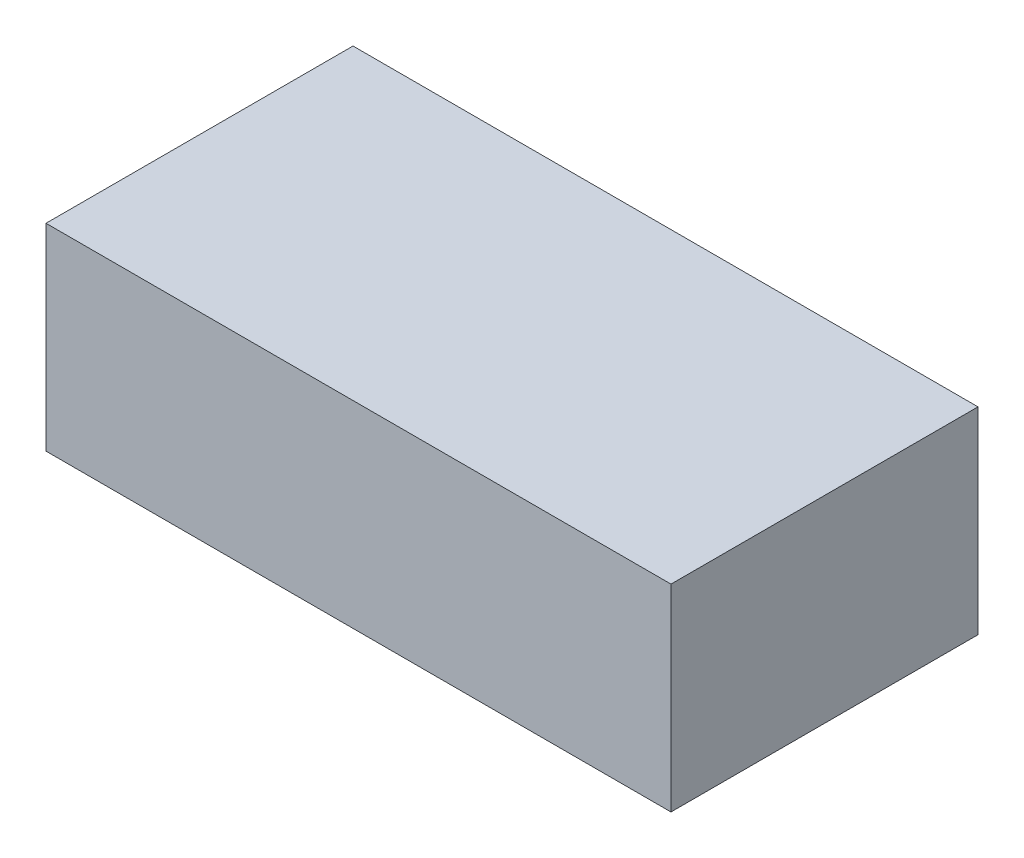
ISO-10303-21;
HEADER;
FILE_DESCRIPTION(('STEP AP214'),'2;1');
FILE_NAME('part.step','',(''),(''),'','','');
FILE_SCHEMA(('AUTOMOTIVE_DESIGN { 1 0 10303 214 1 1 1 1 }'));
ENDSEC;
DATA;
#1=APPLICATION_CONTEXT('core data for automotive mechanical design processes');
#2=APPLICATION_PROTOCOL_DEFINITION('international standard','automotive_design',2000,#1);
#3=PRODUCT_CONTEXT('',#1,'mechanical');
#4=PRODUCT('Part','Part','',(#3));
#5=PRODUCT_RELATED_PRODUCT_CATEGORY('part','',(#4));
#6=PRODUCT_DEFINITION_FORMATION('','',#4);
#7=PRODUCT_DEFINITION_CONTEXT('part definition',#1,'design');
#8=PRODUCT_DEFINITION('design','',#6,#7);
#9=PRODUCT_DEFINITION_SHAPE('','',#8);
#10=(LENGTH_UNIT() NAMED_UNIT(*) SI_UNIT(.MILLI.,.METRE.));
#11=(NAMED_UNIT(*) PLANE_ANGLE_UNIT() SI_UNIT($,.RADIAN.));
#12=(NAMED_UNIT(*) SI_UNIT($,.STERADIAN.) SOLID_ANGLE_UNIT());
#13=UNCERTAINTY_MEASURE_WITH_UNIT(LENGTH_MEASURE(1.E-05),#10,'distance_accuracy_value','');
#14=(GEOMETRIC_REPRESENTATION_CONTEXT(3) GLOBAL_UNCERTAINTY_ASSIGNED_CONTEXT((#13)) GLOBAL_UNIT_ASSIGNED_CONTEXT((#10,
#11,#12)) REPRESENTATION_CONTEXT('',''));
#15=CARTESIAN_POINT('',(0.,0.,0.));
#16=DIRECTION('',(0.,0.,1.));
#17=DIRECTION('',(1.,0.,0.));
#18=AXIS2_PLACEMENT_3D('',#15,#16,#17);
#19=CARTESIAN_POINT('',(0.,18.,28.));
#20=DIRECTION('',(1.,0.,0.));
#21=DIRECTION('',(0.,0.,-1.));
#22=AXIS2_PLACEMENT_3D('',#19,#20,#21);
#23=PLANE('',#22);
#24=DIRECTION('',(0.,-1.,0.));
#25=VECTOR('',#24,1.);
#26=CARTESIAN_POINT('',(0.,18.,0.));
#27=LINE('',#26,#25);
#28=CARTESIAN_POINT('',(0.,18.,0.));
#29=VERTEX_POINT('',#28);
#30=CARTESIAN_POINT('',(0.,0.,0.));
#31=VERTEX_POINT('',#30);
#32=EDGE_CURVE('E102',#29,#31,#27,.T.);
#33=ORIENTED_EDGE('',*,*,#32,.T.);
#34=DIRECTION('',(0.,0.,-1.));
#35=VECTOR('',#34,1.);
#36=CARTESIAN_POINT('',(0.,0.,28.));
#37=LINE('',#36,#35);
#38=CARTESIAN_POINT('',(0.,0.,28.));
#39=VERTEX_POINT('',#38);
#40=EDGE_CURVE('E11',#39,#31,#37,.T.);
#41=ORIENTED_EDGE('',*,*,#40,.F.);
#42=DIRECTION('',(0.,-1.,0.));
#43=VECTOR('',#42,1.);
#44=CARTESIAN_POINT('',(0.,18.,28.));
#45=LINE('',#44,#43);
#46=CARTESIAN_POINT('',(0.,18.,28.));
#47=VERTEX_POINT('',#46);
#48=EDGE_CURVE('E90',#47,#39,#45,.T.);
#49=ORIENTED_EDGE('',*,*,#48,.F.);
#50=DIRECTION('',(0.,0.,-1.));
#51=VECTOR('',#50,1.);
#52=CARTESIAN_POINT('',(0.,18.,28.));
#53=LINE('',#52,#51);
#54=EDGE_CURVE('E98',#47,#29,#53,.T.);
#55=ORIENTED_EDGE('',*,*,#54,.T.);
#56=EDGE_LOOP('',(#33,#41,#49,#55));
#57=FACE_BOUND('',#56,.T.);
#58=ADVANCED_FACE('F39',(#57),#23,.F.);
#59=CARTESIAN_POINT('',(0.,0.,28.));
#60=DIRECTION('',(0.,1.,0.));
#61=DIRECTION('',(0.,0.,1.));
#62=AXIS2_PLACEMENT_3D('',#59,#60,#61);
#63=PLANE('',#62);
#64=DIRECTION('',(1.,0.,0.));
#65=VECTOR('',#64,1.);
#66=CARTESIAN_POINT('',(0.,0.,0.));
#67=LINE('',#66,#65);
#68=CARTESIAN_POINT('',(57.,0.,0.));
#69=VERTEX_POINT('',#68);
#70=EDGE_CURVE('E94',#31,#69,#67,.T.);
#71=ORIENTED_EDGE('',*,*,#70,.T.);
#72=DIRECTION('',(0.,0.,-1.));
#73=VECTOR('',#72,1.);
#74=CARTESIAN_POINT('',(57.,0.,28.));
#75=LINE('',#74,#73);
#76=CARTESIAN_POINT('',(57.,0.,28.));
#77=VERTEX_POINT('',#76);
#78=EDGE_CURVE('E47',#77,#69,#75,.T.);
#79=ORIENTED_EDGE('',*,*,#78,.F.);
#80=DIRECTION('',(1.,0.,0.));
#81=VECTOR('',#80,1.);
#82=CARTESIAN_POINT('',(0.,0.,28.));
#83=LINE('',#82,#81);
#84=EDGE_CURVE('E85',#39,#77,#83,.T.);
#85=ORIENTED_EDGE('',*,*,#84,.F.);
#86=ORIENTED_EDGE('',*,*,#40,.T.);
#87=EDGE_LOOP('',(#71,#79,#85,#86));
#88=FACE_BOUND('',#87,.T.);
#89=ADVANCED_FACE('F93',(#88),#63,.F.);
#90=CARTESIAN_POINT('',(57.,0.,28.));
#91=DIRECTION('',(-1.,0.,0.));
#92=DIRECTION('',(0.,0.,1.));
#93=AXIS2_PLACEMENT_3D('',#90,#91,#92);
#94=PLANE('',#93);
#95=DIRECTION('',(0.,1.,0.));
#96=VECTOR('',#95,1.);
#97=CARTESIAN_POINT('',(57.,0.,0.));
#98=LINE('',#97,#96);
#99=CARTESIAN_POINT('',(57.,18.,0.));
#100=VERTEX_POINT('',#99);
#101=EDGE_CURVE('E72',#69,#100,#98,.T.);
#102=ORIENTED_EDGE('',*,*,#101,.T.);
#103=DIRECTION('',(0.,0.,-1.));
#104=VECTOR('',#103,1.);
#105=CARTESIAN_POINT('',(57.,18.,28.));
#106=LINE('',#105,#104);
#107=CARTESIAN_POINT('',(57.,18.,28.));
#108=VERTEX_POINT('',#107);
#109=EDGE_CURVE('E95',#108,#100,#106,.T.);
#110=ORIENTED_EDGE('',*,*,#109,.F.);
#111=DIRECTION('',(0.,1.,0.));
#112=VECTOR('',#111,1.);
#113=CARTESIAN_POINT('',(57.,0.,28.));
#114=LINE('',#113,#112);
#115=EDGE_CURVE('E88',#77,#108,#114,.T.);
#116=ORIENTED_EDGE('',*,*,#115,.F.);
#117=ORIENTED_EDGE('',*,*,#78,.T.);
#118=EDGE_LOOP('',(#102,#110,#116,#117));
#119=FACE_BOUND('',#118,.T.);
#120=ADVANCED_FACE('F96',(#119),#94,.F.);
#121=CARTESIAN_POINT('',(57.,18.,28.));
#122=DIRECTION('',(0.,-1.,0.));
#123=DIRECTION('',(0.,0.,-1.));
#124=AXIS2_PLACEMENT_3D('',#121,#122,#123);
#125=PLANE('',#124);
#126=DIRECTION('',(-1.,0.,0.));
#127=VECTOR('',#126,1.);
#128=CARTESIAN_POINT('',(57.,18.,0.));
#129=LINE('',#128,#127);
#130=EDGE_CURVE('E78',#100,#29,#129,.T.);
#131=ORIENTED_EDGE('',*,*,#130,.T.);
#132=ORIENTED_EDGE('',*,*,#54,.F.);
#133=DIRECTION('',(-1.,0.,0.));
#134=VECTOR('',#133,1.);
#135=CARTESIAN_POINT('',(57.,18.,28.));
#136=LINE('',#135,#134);
#137=EDGE_CURVE('E55',#108,#47,#136,.T.);
#138=ORIENTED_EDGE('',*,*,#137,.F.);
#139=ORIENTED_EDGE('',*,*,#109,.T.);
#140=EDGE_LOOP('',(#131,#132,#138,#139));
#141=FACE_BOUND('',#140,.T.);
#142=ADVANCED_FACE('F109',(#141),#125,.F.);
#143=CARTESIAN_POINT('',(0.,0.,28.));
#144=DIRECTION('',(0.,0.,1.));
#145=DIRECTION('',(1.,0.,0.));
#146=AXIS2_PLACEMENT_3D('',#143,#144,#145);
#147=PLANE('',#146);
#148=ORIENTED_EDGE('',*,*,#48,.T.);
#149=ORIENTED_EDGE('',*,*,#84,.T.);
#150=ORIENTED_EDGE('',*,*,#115,.T.);
#151=ORIENTED_EDGE('',*,*,#137,.T.);
#152=EDGE_LOOP('',(#148,#149,#150,#151));
#153=FACE_BOUND('',#152,.T.);
#154=ADVANCED_FACE('F86',(#153),#147,.T.);
#155=CARTESIAN_POINT('',(0.,0.,0.));
#156=DIRECTION('',(0.,0.,1.));
#157=DIRECTION('',(1.,0.,0.));
#158=AXIS2_PLACEMENT_3D('',#155,#156,#157);
#159=PLANE('',#158);
#160=ORIENTED_EDGE('',*,*,#32,.F.);
#161=ORIENTED_EDGE('',*,*,#130,.F.);
#162=ORIENTED_EDGE('',*,*,#101,.F.);
#163=ORIENTED_EDGE('',*,*,#70,.F.);
#164=EDGE_LOOP('',(#160,#161,#162,#163));
#165=FACE_BOUND('',#164,.T.);
#166=ADVANCED_FACE('F112',(#165),#159,.F.);
#167=CLOSED_SHELL('',(#58,#89,#120,#142,#154,#166));
#168=MANIFOLD_SOLID_BREP('B2',#167);
#169=ADVANCED_BREP_SHAPE_REPRESENTATION('',(#18,#168),#14);
#170=SHAPE_DEFINITION_REPRESENTATION(#9,#169);
ENDSEC;
END-ISO-10303-21;
